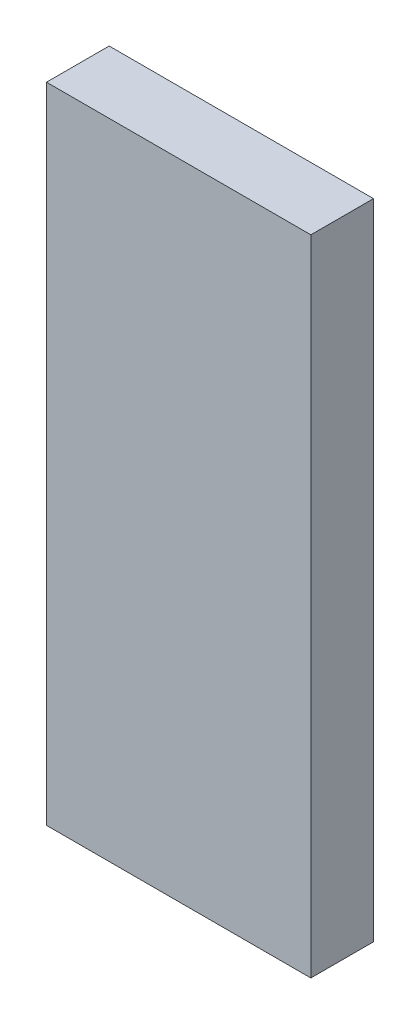
ISO-10303-21;
HEADER;
FILE_DESCRIPTION(('STEP AP214'),'2;1');
FILE_NAME('part.step','',(''),(''),'','','');
FILE_SCHEMA(('AUTOMOTIVE_DESIGN { 1 0 10303 214 1 1 1 1 }'));
ENDSEC;
DATA;
#1=APPLICATION_CONTEXT('core data for automotive mechanical design processes');
#2=APPLICATION_PROTOCOL_DEFINITION('international standard','automotive_design',2000,#1);
#3=PRODUCT_CONTEXT('',#1,'mechanical');
#4=PRODUCT('Part','Part','',(#3));
#5=PRODUCT_RELATED_PRODUCT_CATEGORY('part','',(#4));
#6=PRODUCT_DEFINITION_FORMATION('','',#4);
#7=PRODUCT_DEFINITION_CONTEXT('part definition',#1,'design');
#8=PRODUCT_DEFINITION('design','',#6,#7);
#9=PRODUCT_DEFINITION_SHAPE('','',#8);
#10=(LENGTH_UNIT() NAMED_UNIT(*) SI_UNIT(.MILLI.,.METRE.));
#11=(NAMED_UNIT(*) PLANE_ANGLE_UNIT() SI_UNIT($,.RADIAN.));
#12=(NAMED_UNIT(*) SI_UNIT($,.STERADIAN.) SOLID_ANGLE_UNIT());
#13=UNCERTAINTY_MEASURE_WITH_UNIT(LENGTH_MEASURE(1.E-05),#10,'distance_accuracy_value','');
#14=(GEOMETRIC_REPRESENTATION_CONTEXT(3) GLOBAL_UNCERTAINTY_ASSIGNED_CONTEXT((#13)) GLOBAL_UNIT_ASSIGNED_CONTEXT((#10,
#11,#12)) REPRESENTATION_CONTEXT('',''));
#15=CARTESIAN_POINT('',(0.,0.,0.));
#16=DIRECTION('',(0.,0.,1.));
#17=DIRECTION('',(1.,0.,0.));
#18=AXIS2_PLACEMENT_3D('',#15,#16,#17);
#19=CARTESIAN_POINT('',(0.67499992,-1.643507,0.));
#20=DIRECTION('',(-1.,0.,0.));
#21=DIRECTION('',(0.,1.,0.));
#22=AXIS2_PLACEMENT_3D('',#19,#20,#21);
#23=PLANE('',#22);
#24=DIRECTION('',(0.,1.,0.));
#25=VECTOR('',#24,1.);
#26=CARTESIAN_POINT('',(0.67499992,-1.643507,0.));
#27=LINE('',#26,#25);
#28=CARTESIAN_POINT('',(0.67499992,-1.643507,0.));
#29=VERTEX_POINT('',#28);
#30=CARTESIAN_POINT('',(0.67499992,1.64350954,0.));
#31=VERTEX_POINT('',#30);
#32=EDGE_CURVE('E11',#29,#31,#27,.T.);
#33=ORIENTED_EDGE('',*,*,#32,.T.);
#34=DIRECTION('',(0.,0.,1.));
#35=VECTOR('',#34,1.);
#36=CARTESIAN_POINT('',(0.67499992,1.64350954,0.));
#37=LINE('',#36,#35);
#38=CARTESIAN_POINT('',(0.67499992,1.64350954,0.31999936));
#39=VERTEX_POINT('',#38);
#40=EDGE_CURVE('E24',#31,#39,#37,.T.);
#41=ORIENTED_EDGE('',*,*,#40,.T.);
#42=DIRECTION('',(0.,1.,0.));
#43=VECTOR('',#42,1.);
#44=CARTESIAN_POINT('',(0.67499992,-1.643507,0.31999936));
#45=LINE('',#44,#43);
#46=CARTESIAN_POINT('',(0.67499992,-1.643507,0.31999936));
#47=VERTEX_POINT('',#46);
#48=EDGE_CURVE('E87',#47,#39,#45,.T.);
#49=ORIENTED_EDGE('',*,*,#48,.F.);
#50=DIRECTION('',(0.,0.,1.));
#51=VECTOR('',#50,1.);
#52=CARTESIAN_POINT('',(0.67499992,-1.643507,0.));
#53=LINE('',#52,#51);
#54=EDGE_CURVE('E36',#29,#47,#53,.T.);
#55=ORIENTED_EDGE('',*,*,#54,.F.);
#56=EDGE_LOOP('',(#33,#41,#49,#55));
#57=FACE_BOUND('',#56,.T.);
#58=ADVANCED_FACE('F17',(#57),#23,.F.);
#59=CARTESIAN_POINT('',(0.67499992,1.64350954,0.));
#60=DIRECTION('',(0.,-1.,0.));
#61=DIRECTION('',(-1.,0.,0.));
#62=AXIS2_PLACEMENT_3D('',#59,#60,#61);
#63=PLANE('',#62);
#64=DIRECTION('',(-1.,0.,0.));
#65=VECTOR('',#64,1.);
#66=CARTESIAN_POINT('',(0.67499992,1.64350954,0.));
#67=LINE('',#66,#65);
#68=CARTESIAN_POINT('',(-0.67499992,1.64350954,0.));
#69=VERTEX_POINT('',#68);
#70=EDGE_CURVE('E84',#31,#69,#67,.T.);
#71=ORIENTED_EDGE('',*,*,#70,.T.);
#72=DIRECTION('',(0.,0.,1.));
#73=VECTOR('',#72,1.);
#74=CARTESIAN_POINT('',(-0.67499992,1.64350954,0.));
#75=LINE('',#74,#73);
#76=CARTESIAN_POINT('',(-0.67499992,1.64350954,0.31999936));
#77=VERTEX_POINT('',#76);
#78=EDGE_CURVE('E82',#69,#77,#75,.T.);
#79=ORIENTED_EDGE('',*,*,#78,.T.);
#80=DIRECTION('',(-1.,0.,0.));
#81=VECTOR('',#80,1.);
#82=CARTESIAN_POINT('',(0.67499992,1.64350954,0.31999936));
#83=LINE('',#82,#81);
#84=EDGE_CURVE('E62',#39,#77,#83,.T.);
#85=ORIENTED_EDGE('',*,*,#84,.F.);
#86=ORIENTED_EDGE('',*,*,#40,.F.);
#87=EDGE_LOOP('',(#71,#79,#85,#86));
#88=FACE_BOUND('',#87,.T.);
#89=ADVANCED_FACE('F89',(#88),#63,.F.);
#90=CARTESIAN_POINT('',(-0.67499992,1.64350954,0.));
#91=DIRECTION('',(1.,0.,0.));
#92=DIRECTION('',(0.,-1.,0.));
#93=AXIS2_PLACEMENT_3D('',#90,#91,#92);
#94=PLANE('',#93);
#95=DIRECTION('',(0.,-1.,0.));
#96=VECTOR('',#95,1.);
#97=CARTESIAN_POINT('',(-0.67499992,1.64350954,0.));
#98=LINE('',#97,#96);
#99=CARTESIAN_POINT('',(-0.67499992,-1.643507,0.));
#100=VERTEX_POINT('',#99);
#101=EDGE_CURVE('E71',#69,#100,#98,.T.);
#102=ORIENTED_EDGE('',*,*,#101,.T.);
#103=DIRECTION('',(0.,0.,1.));
#104=VECTOR('',#103,1.);
#105=CARTESIAN_POINT('',(-0.67499992,-1.643507,0.));
#106=LINE('',#105,#104);
#107=CARTESIAN_POINT('',(-0.67499992,-1.643507,0.31999936));
#108=VERTEX_POINT('',#107);
#109=EDGE_CURVE('E65',#100,#108,#106,.T.);
#110=ORIENTED_EDGE('',*,*,#109,.T.);
#111=DIRECTION('',(0.,-1.,0.));
#112=VECTOR('',#111,1.);
#113=CARTESIAN_POINT('',(-0.67499992,1.64350954,0.31999936));
#114=LINE('',#113,#112);
#115=EDGE_CURVE('E57',#77,#108,#114,.T.);
#116=ORIENTED_EDGE('',*,*,#115,.F.);
#117=ORIENTED_EDGE('',*,*,#78,.F.);
#118=EDGE_LOOP('',(#102,#110,#116,#117));
#119=FACE_BOUND('',#118,.T.);
#120=ADVANCED_FACE('F69',(#119),#94,.F.);
#121=CARTESIAN_POINT('',(-0.67499992,-1.643507,0.));
#122=DIRECTION('',(0.,1.,0.));
#123=DIRECTION('',(1.,0.,0.));
#124=AXIS2_PLACEMENT_3D('',#121,#122,#123);
#125=PLANE('',#124);
#126=DIRECTION('',(1.,0.,0.));
#127=VECTOR('',#126,1.);
#128=CARTESIAN_POINT('',(-0.67499992,-1.643507,0.));
#129=LINE('',#128,#127);
#130=EDGE_CURVE('E66',#100,#29,#129,.T.);
#131=ORIENTED_EDGE('',*,*,#130,.T.);
#132=ORIENTED_EDGE('',*,*,#54,.T.);
#133=DIRECTION('',(1.,0.,0.));
#134=VECTOR('',#133,1.);
#135=CARTESIAN_POINT('',(-0.67499992,-1.643507,0.31999936));
#136=LINE('',#135,#134);
#137=EDGE_CURVE('E61',#108,#47,#136,.T.);
#138=ORIENTED_EDGE('',*,*,#137,.F.);
#139=ORIENTED_EDGE('',*,*,#109,.F.);
#140=EDGE_LOOP('',(#131,#132,#138,#139));
#141=FACE_BOUND('',#140,.T.);
#142=ADVANCED_FACE('F76',(#141),#125,.F.);
#143=CARTESIAN_POINT('',(0.,1.269999998412E-06,0.));
#144=DIRECTION('',(0.,0.,1.));
#145=DIRECTION('',(1.,0.,0.));
#146=AXIS2_PLACEMENT_3D('',#143,#144,#145);
#147=PLANE('',#146);
#148=ORIENTED_EDGE('',*,*,#130,.F.);
#149=ORIENTED_EDGE('',*,*,#101,.F.);
#150=ORIENTED_EDGE('',*,*,#70,.F.);
#151=ORIENTED_EDGE('',*,*,#32,.F.);
#152=EDGE_LOOP('',(#148,#149,#150,#151));
#153=FACE_BOUND('',#152,.T.);
#154=ADVANCED_FACE('F91',(#153),#147,.F.);
#155=CARTESIAN_POINT('',(0.,1.269999998412E-06,0.31999936));
#156=DIRECTION('',(0.,0.,1.));
#157=DIRECTION('',(1.,0.,0.));
#158=AXIS2_PLACEMENT_3D('',#155,#156,#157);
#159=PLANE('',#158);
#160=ORIENTED_EDGE('',*,*,#48,.T.);
#161=ORIENTED_EDGE('',*,*,#84,.T.);
#162=ORIENTED_EDGE('',*,*,#115,.T.);
#163=ORIENTED_EDGE('',*,*,#137,.T.);
#164=EDGE_LOOP('',(#160,#161,#162,#163));
#165=FACE_BOUND('',#164,.T.);
#166=ADVANCED_FACE('F59',(#165),#159,.T.);
#167=CLOSED_SHELL('',(#58,#89,#120,#142,#154,#166));
#168=MANIFOLD_SOLID_BREP('B1',#167);
#169=ADVANCED_BREP_SHAPE_REPRESENTATION('',(#18,#168),#14);
#170=SHAPE_DEFINITION_REPRESENTATION(#9,#169);
ENDSEC;
END-ISO-10303-21;
